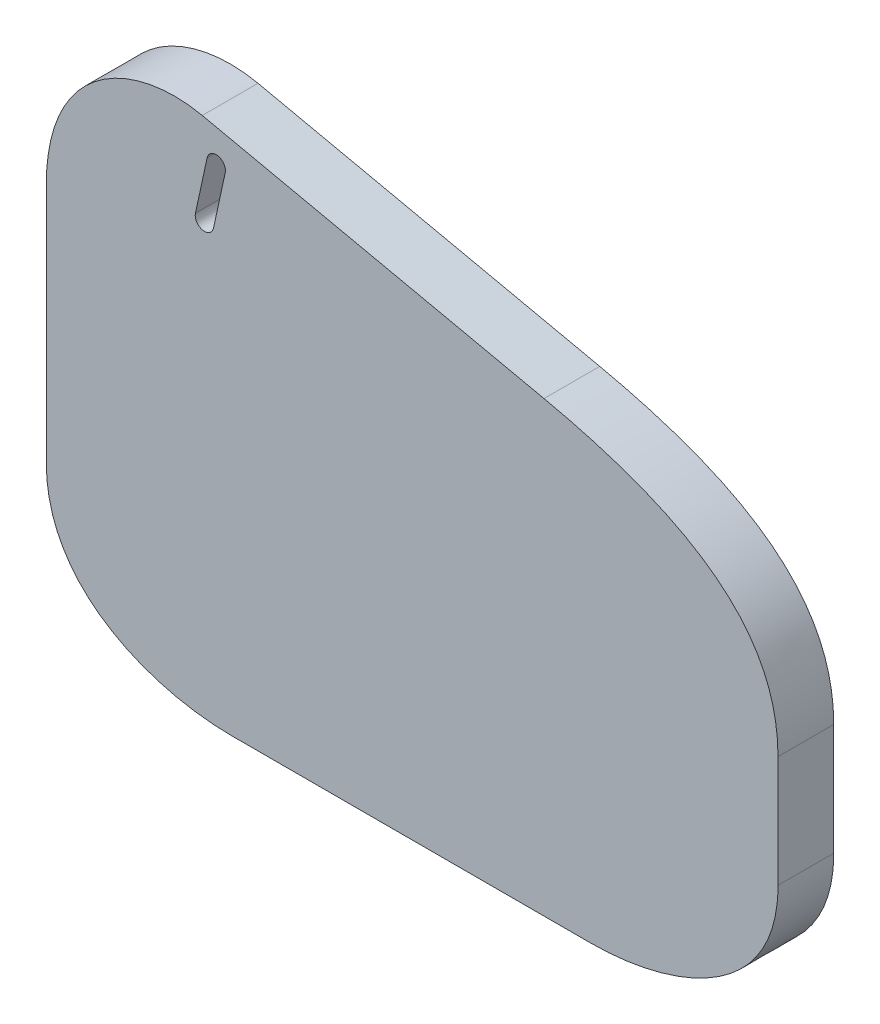
ISO-10303-21;
HEADER;
FILE_DESCRIPTION(('STEP AP214'),'2;1');
FILE_NAME('part.step','',(''),(''),'','','');
FILE_SCHEMA(('AUTOMOTIVE_DESIGN { 1 0 10303 214 1 1 1 1 }'));
ENDSEC;
DATA;
#1=APPLICATION_CONTEXT('core data for automotive mechanical design processes');
#2=APPLICATION_PROTOCOL_DEFINITION('international standard','automotive_design',2000,#1);
#3=PRODUCT_CONTEXT('',#1,'mechanical');
#4=PRODUCT('Part','Part','',(#3));
#5=PRODUCT_RELATED_PRODUCT_CATEGORY('part','',(#4));
#6=PRODUCT_DEFINITION_FORMATION('','',#4);
#7=PRODUCT_DEFINITION_CONTEXT('part definition',#1,'design');
#8=PRODUCT_DEFINITION('design','',#6,#7);
#9=PRODUCT_DEFINITION_SHAPE('','',#8);
#10=(LENGTH_UNIT() NAMED_UNIT(*) SI_UNIT(.MILLI.,.METRE.));
#11=(NAMED_UNIT(*) PLANE_ANGLE_UNIT() SI_UNIT($,.RADIAN.));
#12=(NAMED_UNIT(*) SI_UNIT($,.STERADIAN.) SOLID_ANGLE_UNIT());
#13=UNCERTAINTY_MEASURE_WITH_UNIT(LENGTH_MEASURE(1.E-05),#10,'distance_accuracy_value','');
#14=(GEOMETRIC_REPRESENTATION_CONTEXT(3) GLOBAL_UNCERTAINTY_ASSIGNED_CONTEXT((#13)) GLOBAL_UNIT_ASSIGNED_CONTEXT((#10,
#11,#12)) REPRESENTATION_CONTEXT('',''));
#15=CARTESIAN_POINT('',(0.,0.,0.));
#16=DIRECTION('',(0.,0.,1.));
#17=DIRECTION('',(1.,0.,0.));
#18=AXIS2_PLACEMENT_3D('',#15,#16,#17);
#19=CARTESIAN_POINT('',(-33.5451291028447,-25.7697680525164,10.));
#20=CARTESIAN_POINT('',(-19.4448665678301,-25.7697680525164,10.));
#21=CARTESIAN_POINT('',(0.,-19.0637574545764,10.));
#22=CARTESIAN_POINT('',(0.,0.,10.));
#23=B_SPLINE_CURVE_WITH_KNOTS('',3,(#19,#20,#21,#22),.UNSPECIFIED.,.F.,.F.,(4,4),(0.,1.),.UNSPECIFIED.);
#24=DIRECTION('',(0.,0.,-1.));
#25=VECTOR('',#24,1.);
#26=SURFACE_OF_LINEAR_EXTRUSION('',#23,#25);
#27=CARTESIAN_POINT('',(-33.5451291028447,-25.7697680525164,0.));
#28=CARTESIAN_POINT('',(-19.4448665678301,-25.7697680525164,0.));
#29=CARTESIAN_POINT('',(0.,-19.0637574545764,0.));
#30=CARTESIAN_POINT('',(0.,0.,0.));
#31=B_SPLINE_CURVE_WITH_KNOTS('',3,(#27,#28,#29,#30),.UNSPECIFIED.,.F.,.F.,(4,4),(0.,1.),.UNSPECIFIED.);
#32=CARTESIAN_POINT('',(-33.5451291028447,-25.7697680525164,0.));
#33=VERTEX_POINT('',#32);
#34=CARTESIAN_POINT('',(0.,0.,0.));
#35=VERTEX_POINT('',#34);
#36=EDGE_CURVE('E158',#33,#35,#31,.T.);
#37=ORIENTED_EDGE('',*,*,#36,.T.);
#38=DIRECTION('',(0.,0.,-1.));
#39=VECTOR('',#38,1.);
#40=CARTESIAN_POINT('',(0.,0.,10.));
#41=LINE('',#40,#39);
#42=CARTESIAN_POINT('',(0.,0.,10.));
#43=VERTEX_POINT('',#42);
#44=EDGE_CURVE('E11',#43,#35,#41,.T.);
#45=ORIENTED_EDGE('',*,*,#44,.F.);
#46=CARTESIAN_POINT('',(-33.5451291028447,-25.7697680525164,10.));
#47=VERTEX_POINT('',#46);
#48=EDGE_CURVE('E161',#47,#43,#23,.T.);
#49=ORIENTED_EDGE('',*,*,#48,.F.);
#50=DIRECTION('',(0.,0.,-1.));
#51=VECTOR('',#50,1.);
#52=CARTESIAN_POINT('',(-33.5451291028447,-25.7697680525164,10.));
#53=LINE('',#52,#51);
#54=EDGE_CURVE('E241',#47,#33,#53,.T.);
#55=ORIENTED_EDGE('',*,*,#54,.T.);
#56=EDGE_LOOP('',(#37,#45,#49,#55));
#57=FACE_BOUND('',#56,.T.);
#58=ADVANCED_FACE('F36',(#57),#26,.F.);
#59=CARTESIAN_POINT('',(0.,0.,10.));
#60=DIRECTION('',(-1.,0.,0.));
#61=DIRECTION('',(0.,0.,1.));
#62=AXIS2_PLACEMENT_3D('',#59,#60,#61);
#63=PLANE('',#62);
#64=DIRECTION('',(0.,1.,0.));
#65=VECTOR('',#64,1.);
#66=CARTESIAN_POINT('',(0.,0.,0.));
#67=LINE('',#66,#65);
#68=CARTESIAN_POINT('',(0.,20.,0.));
#69=VERTEX_POINT('',#68);
#70=EDGE_CURVE('E198',#35,#69,#67,.T.);
#71=ORIENTED_EDGE('',*,*,#70,.T.);
#72=DIRECTION('',(0.,0.,-1.));
#73=VECTOR('',#72,1.);
#74=CARTESIAN_POINT('',(0.,20.,10.));
#75=LINE('',#74,#73);
#76=CARTESIAN_POINT('',(0.,20.,10.));
#77=VERTEX_POINT('',#76);
#78=EDGE_CURVE('E44',#77,#69,#75,.T.);
#79=ORIENTED_EDGE('',*,*,#78,.F.);
#80=DIRECTION('',(0.,1.,0.));
#81=VECTOR('',#80,1.);
#82=CARTESIAN_POINT('',(0.,0.,10.));
#83=LINE('',#82,#81);
#84=EDGE_CURVE('E167',#43,#77,#83,.T.);
#85=ORIENTED_EDGE('',*,*,#84,.F.);
#86=ORIENTED_EDGE('',*,*,#44,.T.);
#87=EDGE_LOOP('',(#71,#79,#85,#86));
#88=FACE_BOUND('',#87,.T.);
#89=ADVANCED_FACE('F188',(#88),#63,.F.);
#90=CARTESIAN_POINT('',(0.,20.,10.));
#91=CARTESIAN_POINT('',(0.,38.1460258986672,10.));
#92=CARTESIAN_POINT('',(-14.2094741821754,48.6110988969908,10.));
#93=CARTESIAN_POINT('',(-41.9869496717725,54.6496805251641,10.));
#94=B_SPLINE_CURVE_WITH_KNOTS('',3,(#90,#91,#92,#93),.UNSPECIFIED.,.F.,.F.,(4,4),(0.,1.),.UNSPECIFIED.);
#95=DIRECTION('',(0.,0.,-1.));
#96=VECTOR('',#95,1.);
#97=SURFACE_OF_LINEAR_EXTRUSION('',#94,#96);
#98=CARTESIAN_POINT('',(0.,20.,0.));
#99=CARTESIAN_POINT('',(0.,38.1460258986672,0.));
#100=CARTESIAN_POINT('',(-14.2094741821754,48.6110988969908,0.));
#101=CARTESIAN_POINT('',(-41.9869496717725,54.6496805251641,0.));
#102=B_SPLINE_CURVE_WITH_KNOTS('',3,(#98,#99,#100,#101),.UNSPECIFIED.,.F.,.F.,(4,4),(0.,1.),.UNSPECIFIED.);
#103=CARTESIAN_POINT('',(-41.9869496717725,54.6496805251641,0.));
#104=VERTEX_POINT('',#103);
#105=EDGE_CURVE('E206',#69,#104,#102,.T.);
#106=ORIENTED_EDGE('',*,*,#105,.T.);
#107=DIRECTION('',(0.,0.,-1.));
#108=VECTOR('',#107,1.);
#109=CARTESIAN_POINT('',(-41.9869496717725,54.6496805251641,10.));
#110=LINE('',#109,#108);
#111=CARTESIAN_POINT('',(-41.9869496717725,54.6496805251641,10.));
#112=VERTEX_POINT('',#111);
#113=EDGE_CURVE('E210',#112,#104,#110,.T.);
#114=ORIENTED_EDGE('',*,*,#113,.F.);
#115=EDGE_CURVE('E173',#77,#112,#94,.T.);
#116=ORIENTED_EDGE('',*,*,#115,.F.);
#117=ORIENTED_EDGE('',*,*,#78,.T.);
#118=EDGE_LOOP('',(#106,#114,#116,#117));
#119=FACE_BOUND('',#118,.T.);
#120=ADVANCED_FACE('F184',(#119),#97,.F.);
#121=CARTESIAN_POINT('',(-41.9869496717725,54.6496805251641,10.));
#122=DIRECTION('',(-0.212429644331044,-0.977176363922801,0.));
#123=DIRECTION('',(0.977176363922801,-0.212429644331044,0.));
#124=AXIS2_PLACEMENT_3D('',#121,#122,#123);
#125=PLANE('',#124);
#126=DIRECTION('',(-0.977176363922801,0.212429644331044,0.));
#127=VECTOR('',#126,1.);
#128=CARTESIAN_POINT('',(-41.9869496717725,54.6496805251641,0.));
#129=LINE('',#128,#127);
#130=CARTESIAN_POINT('',(-103.301225382932,67.9788708971554,0.));
#131=VERTEX_POINT('',#130);
#132=EDGE_CURVE('E214',#104,#131,#129,.T.);
#133=ORIENTED_EDGE('',*,*,#132,.T.);
#134=DIRECTION('',(0.,0.,-1.));
#135=VECTOR('',#134,1.);
#136=CARTESIAN_POINT('',(-103.301225382932,67.9788708971554,10.));
#137=LINE('',#136,#135);
#138=CARTESIAN_POINT('',(-103.301225382932,67.9788708971554,10.));
#139=VERTEX_POINT('',#138);
#140=EDGE_CURVE('E254',#139,#131,#137,.T.);
#141=ORIENTED_EDGE('',*,*,#140,.F.);
#142=DIRECTION('',(-0.977176363922801,0.212429644331044,0.));
#143=VECTOR('',#142,1.);
#144=CARTESIAN_POINT('',(-41.9869496717725,54.6496805251641,10.));
#145=LINE('',#144,#143);
#146=EDGE_CURVE('E178',#112,#139,#145,.T.);
#147=ORIENTED_EDGE('',*,*,#146,.F.);
#148=ORIENTED_EDGE('',*,*,#113,.T.);
#149=EDGE_LOOP('',(#133,#141,#147,#148));
#150=FACE_BOUND('',#149,.T.);
#151=ADVANCED_FACE('F187',(#150),#125,.F.);
#152=CARTESIAN_POINT('',(-103.301225382932,67.9788708971554,10.));
#153=CARTESIAN_POINT('',(-115.500001367253,70.6307787198339,10.));
#154=CARTESIAN_POINT('',(-131.292525164114,63.3933061839038,10.));
#155=CARTESIAN_POINT('',(-131.292525164114,43.097715536105,10.));
#156=B_SPLINE_CURVE_WITH_KNOTS('',3,(#152,#153,#154,#155),.UNSPECIFIED.,.F.,.F.,(4,4),(0.,1.),.UNSPECIFIED.);
#157=DIRECTION('',(0.,0.,-1.));
#158=VECTOR('',#157,1.);
#159=SURFACE_OF_LINEAR_EXTRUSION('',#156,#158);
#160=CARTESIAN_POINT('',(-103.301225382932,67.9788708971554,0.));
#161=CARTESIAN_POINT('',(-115.500001367253,70.6307787198339,0.));
#162=CARTESIAN_POINT('',(-131.292525164114,63.3933061839038,0.));
#163=CARTESIAN_POINT('',(-131.292525164114,43.097715536105,0.));
#164=B_SPLINE_CURVE_WITH_KNOTS('',3,(#160,#161,#162,#163),.UNSPECIFIED.,.F.,.F.,(4,4),(0.,1.),.UNSPECIFIED.);
#165=CARTESIAN_POINT('',(-131.292525164114,43.097715536105,0.));
#166=VERTEX_POINT('',#165);
#167=EDGE_CURVE('E216',#131,#166,#164,.T.);
#168=ORIENTED_EDGE('',*,*,#167,.T.);
#169=DIRECTION('',(0.,0.,-1.));
#170=VECTOR('',#169,1.);
#171=CARTESIAN_POINT('',(-131.292525164114,43.097715536105,10.));
#172=LINE('',#171,#170);
#173=CARTESIAN_POINT('',(-131.292525164114,43.097715536105,10.));
#174=VERTEX_POINT('',#173);
#175=EDGE_CURVE('E251',#174,#166,#172,.T.);
#176=ORIENTED_EDGE('',*,*,#175,.F.);
#177=EDGE_CURVE('E261',#139,#174,#156,.T.);
#178=ORIENTED_EDGE('',*,*,#177,.F.);
#179=ORIENTED_EDGE('',*,*,#140,.T.);
#180=EDGE_LOOP('',(#168,#176,#178,#179));
#181=FACE_BOUND('',#180,.T.);
#182=ADVANCED_FACE('F273',(#181),#159,.F.);
#183=CARTESIAN_POINT('',(-131.292525164114,43.097715536105,10.));
#184=DIRECTION('',(1.,0.,0.));
#185=DIRECTION('',(0.,0.,-1.));
#186=AXIS2_PLACEMENT_3D('',#183,#184,#185);
#187=PLANE('',#186);
#188=DIRECTION('',(0.,-1.,0.));
#189=VECTOR('',#188,1.);
#190=CARTESIAN_POINT('',(-131.292525164114,43.097715536105,0.));
#191=LINE('',#190,#189);
#192=CARTESIAN_POINT('',(-131.292525164114,0.,0.));
#193=VERTEX_POINT('',#192);
#194=EDGE_CURVE('E228',#166,#193,#191,.T.);
#195=ORIENTED_EDGE('',*,*,#194,.T.);
#196=DIRECTION('',(0.,0.,-1.));
#197=VECTOR('',#196,1.);
#198=CARTESIAN_POINT('',(-131.292525164114,0.,10.));
#199=LINE('',#198,#197);
#200=CARTESIAN_POINT('',(-131.292525164114,0.,10.));
#201=VERTEX_POINT('',#200);
#202=EDGE_CURVE('E248',#201,#193,#199,.T.);
#203=ORIENTED_EDGE('',*,*,#202,.F.);
#204=DIRECTION('',(0.,-1.,0.));
#205=VECTOR('',#204,1.);
#206=CARTESIAN_POINT('',(-131.292525164114,43.097715536105,10.));
#207=LINE('',#206,#205);
#208=EDGE_CURVE('E262',#174,#201,#207,.T.);
#209=ORIENTED_EDGE('',*,*,#208,.F.);
#210=ORIENTED_EDGE('',*,*,#175,.T.);
#211=EDGE_LOOP('',(#195,#203,#209,#210));
#212=FACE_BOUND('',#211,.T.);
#213=ADVANCED_FACE('F276',(#212),#187,.F.);
#214=CARTESIAN_POINT('',(-131.292525164114,0.,10.));
#215=CARTESIAN_POINT('',(-131.292525164114,-19.0251558180361,10.));
#216=CARTESIAN_POINT('',(-112.011160689261,-25.7697680525164,10.));
#217=CARTESIAN_POINT('',(-97.9695492341357,-25.7697680525164,10.));
#218=B_SPLINE_CURVE_WITH_KNOTS('',3,(#214,#215,#216,#217),.UNSPECIFIED.,.F.,.F.,(4,4),(0.,1.),.UNSPECIFIED.);
#219=DIRECTION('',(0.,0.,-1.));
#220=VECTOR('',#219,1.);
#221=SURFACE_OF_LINEAR_EXTRUSION('',#218,#220);
#222=CARTESIAN_POINT('',(-131.292525164114,0.,0.));
#223=CARTESIAN_POINT('',(-131.292525164114,-19.0251558180361,0.));
#224=CARTESIAN_POINT('',(-112.011160689261,-25.7697680525164,0.));
#225=CARTESIAN_POINT('',(-97.9695492341357,-25.7697680525164,0.));
#226=B_SPLINE_CURVE_WITH_KNOTS('',3,(#222,#223,#224,#225),.UNSPECIFIED.,.F.,.F.,(4,4),(0.,1.),.UNSPECIFIED.);
#227=CARTESIAN_POINT('',(-97.9695492341357,-25.7697680525164,0.));
#228=VERTEX_POINT('',#227);
#229=EDGE_CURVE('E233',#193,#228,#226,.T.);
#230=ORIENTED_EDGE('',*,*,#229,.T.);
#231=DIRECTION('',(0.,0.,-1.));
#232=VECTOR('',#231,1.);
#233=CARTESIAN_POINT('',(-97.9695492341357,-25.7697680525164,10.));
#234=LINE('',#233,#232);
#235=CARTESIAN_POINT('',(-97.9695492341357,-25.7697680525164,10.));
#236=VERTEX_POINT('',#235);
#237=EDGE_CURVE('E244',#236,#228,#234,.T.);
#238=ORIENTED_EDGE('',*,*,#237,.F.);
#239=EDGE_CURVE('E264',#201,#236,#218,.T.);
#240=ORIENTED_EDGE('',*,*,#239,.F.);
#241=ORIENTED_EDGE('',*,*,#202,.T.);
#242=EDGE_LOOP('',(#230,#238,#240,#241));
#243=FACE_BOUND('',#242,.T.);
#244=ADVANCED_FACE('F280',(#243),#221,.F.);
#245=CARTESIAN_POINT('',(-33.5451291028447,-25.7697680525164,10.));
#246=DIRECTION('',(0.,1.,0.));
#247=DIRECTION('',(0.,0.,1.));
#248=AXIS2_PLACEMENT_3D('',#245,#246,#247);
#249=PLANE('',#248);
#250=DIRECTION('',(1.,0.,0.));
#251=VECTOR('',#250,1.);
#252=CARTESIAN_POINT('',(-33.5451291028447,-25.7697680525164,0.));
#253=LINE('',#252,#251);
#254=EDGE_CURVE('E168',#228,#33,#253,.T.);
#255=ORIENTED_EDGE('',*,*,#254,.T.);
#256=ORIENTED_EDGE('',*,*,#54,.F.);
#257=DIRECTION('',(1.,0.,0.));
#258=VECTOR('',#257,1.);
#259=CARTESIAN_POINT('',(-33.5451291028447,-25.7697680525164,10.));
#260=LINE('',#259,#258);
#261=EDGE_CURVE('E245',#236,#47,#260,.T.);
#262=ORIENTED_EDGE('',*,*,#261,.F.);
#263=ORIENTED_EDGE('',*,*,#237,.T.);
#264=EDGE_LOOP('',(#255,#256,#262,#263));
#265=FACE_BOUND('',#264,.T.);
#266=ADVANCED_FACE('F284',(#265),#249,.F.);
#267=CARTESIAN_POINT('',(-11.4849661007919,-20.0337930717244,10.));
#268=DIRECTION('',(0.,0.,-1.));
#269=DIRECTION('',(-1.,0.,0.));
#270=AXIS2_PLACEMENT_3D('',#267,#268,#269);
#271=PLANE('',#270);
#272=DIRECTION('',(-0.212429644331042,-0.977176363922801,0.));
#273=VECTOR('',#272,1.);
#274=CARTESIAN_POINT('',(-102.429251955031,61.8328823716601,10.));
#275=LINE('',#274,#273);
#276=CARTESIAN_POINT('',(-102.429251955031,61.8328823716601,10.));
#277=VERTEX_POINT('',#276);
#278=CARTESIAN_POINT('',(-104.52778969342,52.1796087750684,10.));
#279=VERTEX_POINT('',#278);
#280=EDGE_CURVE('E134',#277,#279,#275,.T.);
#281=ORIENTED_EDGE('',*,*,#280,.F.);
#282=CARTESIAN_POINT('',(-100.808408277594,61.4805250504783,10.));
#283=DIRECTION('',(0.,0.,-1.));
#284=DIRECTION('',(-1.,0.,0.));
#285=AXIS2_PLACEMENT_3D('',#282,#283,#284);
#286=CIRCLE('',#285,1.65870127162068);
#287=CARTESIAN_POINT('',(-99.1875646001578,61.1281677292964,10.));
#288=VERTEX_POINT('',#287);
#289=EDGE_CURVE('E128',#277,#288,#286,.T.);
#290=ORIENTED_EDGE('',*,*,#289,.T.);
#291=DIRECTION('',(-0.212429644331042,-0.977176363922801,0.));
#292=VECTOR('',#291,1.);
#293=CARTESIAN_POINT('',(-99.1875646001578,61.1281677292964,10.));
#294=LINE('',#293,#292);
#295=CARTESIAN_POINT('',(-101.286102338547,51.4748941327048,10.));
#296=VERTEX_POINT('',#295);
#297=EDGE_CURVE('E137',#288,#296,#294,.T.);
#298=ORIENTED_EDGE('',*,*,#297,.T.);
#299=CARTESIAN_POINT('',(-102.906946015984,51.8272514538866,10.));
#300=DIRECTION('',(0.,0.,-1.));
#301=DIRECTION('',(-1.,0.,0.));
#302=AXIS2_PLACEMENT_3D('',#299,#300,#301);
#303=CIRCLE('',#302,1.65870127162068);
#304=EDGE_CURVE('E51',#296,#279,#303,.T.);
#305=ORIENTED_EDGE('',*,*,#304,.T.);
#306=EDGE_LOOP('',(#281,#290,#298,#305));
#307=FACE_BOUND('',#306,.T.);
#308=ORIENTED_EDGE('',*,*,#48,.T.);
#309=ORIENTED_EDGE('',*,*,#84,.T.);
#310=ORIENTED_EDGE('',*,*,#115,.T.);
#311=ORIENTED_EDGE('',*,*,#146,.T.);
#312=ORIENTED_EDGE('',*,*,#177,.T.);
#313=ORIENTED_EDGE('',*,*,#208,.T.);
#314=ORIENTED_EDGE('',*,*,#239,.T.);
#315=ORIENTED_EDGE('',*,*,#261,.T.);
#316=EDGE_LOOP('',(#308,#309,#310,#311,#312,#313,#314,#315));
#317=FACE_BOUND('',#316,.T.);
#318=ADVANCED_FACE('F141',(#307,#317),#271,.F.);
#319=CARTESIAN_POINT('',(-11.4849661007919,-20.0337930717244,0.));
#320=DIRECTION('',(0.,0.,-1.));
#321=DIRECTION('',(-1.,0.,0.));
#322=AXIS2_PLACEMENT_3D('',#319,#320,#321);
#323=PLANE('',#322);
#324=CARTESIAN_POINT('',(-100.808408277594,61.4805250504783,0.));
#325=DIRECTION('',(0.,0.,-1.));
#326=DIRECTION('',(-1.,0.,0.));
#327=AXIS2_PLACEMENT_3D('',#324,#325,#326);
#328=CIRCLE('',#327,1.65870127162068);
#329=CARTESIAN_POINT('',(-102.429251955031,61.8328823716601,0.));
#330=VERTEX_POINT('',#329);
#331=CARTESIAN_POINT('',(-99.1875646001578,61.1281677292964,0.));
#332=VERTEX_POINT('',#331);
#333=EDGE_CURVE('E59',#330,#332,#328,.T.);
#334=ORIENTED_EDGE('',*,*,#333,.F.);
#335=DIRECTION('',(-0.212429644331042,-0.977176363922801,0.));
#336=VECTOR('',#335,1.);
#337=CARTESIAN_POINT('',(-102.429251955031,61.8328823716601,0.));
#338=LINE('',#337,#336);
#339=CARTESIAN_POINT('',(-104.52778969342,52.1796087750684,0.));
#340=VERTEX_POINT('',#339);
#341=EDGE_CURVE('E143',#330,#340,#338,.T.);
#342=ORIENTED_EDGE('',*,*,#341,.T.);
#343=CARTESIAN_POINT('',(-102.906946015984,51.8272514538866,0.));
#344=DIRECTION('',(0.,0.,-1.));
#345=DIRECTION('',(-1.,0.,0.));
#346=AXIS2_PLACEMENT_3D('',#343,#344,#345);
#347=CIRCLE('',#346,1.65870127162068);
#348=CARTESIAN_POINT('',(-101.286102338547,51.4748941327048,0.));
#349=VERTEX_POINT('',#348);
#350=EDGE_CURVE('E146',#349,#340,#347,.T.);
#351=ORIENTED_EDGE('',*,*,#350,.F.);
#352=DIRECTION('',(-0.212429644331042,-0.977176363922801,0.));
#353=VECTOR('',#352,1.);
#354=CARTESIAN_POINT('',(-99.1875646001578,61.1281677292964,0.));
#355=LINE('',#354,#353);
#356=EDGE_CURVE('E152',#332,#349,#355,.T.);
#357=ORIENTED_EDGE('',*,*,#356,.F.);
#358=EDGE_LOOP('',(#334,#342,#351,#357));
#359=FACE_BOUND('',#358,.T.);
#360=ORIENTED_EDGE('',*,*,#36,.F.);
#361=ORIENTED_EDGE('',*,*,#254,.F.);
#362=ORIENTED_EDGE('',*,*,#229,.F.);
#363=ORIENTED_EDGE('',*,*,#194,.F.);
#364=ORIENTED_EDGE('',*,*,#167,.F.);
#365=ORIENTED_EDGE('',*,*,#132,.F.);
#366=ORIENTED_EDGE('',*,*,#105,.F.);
#367=ORIENTED_EDGE('',*,*,#70,.F.);
#368=EDGE_LOOP('',(#360,#361,#362,#363,#364,#365,#366,#367));
#369=FACE_BOUND('',#368,.T.);
#370=ADVANCED_FACE('F212',(#359,#369),#323,.T.);
#371=CARTESIAN_POINT('',(-100.808408277594,61.4805250504783,10.));
#372=DIRECTION('',(0.,0.,-1.));
#373=DIRECTION('',(-1.,0.,0.));
#374=AXIS2_PLACEMENT_3D('',#371,#372,#373);
#375=CYLINDRICAL_SURFACE('',#374,1.65870127162068);
#376=ORIENTED_EDGE('',*,*,#333,.T.);
#377=DIRECTION('',(0.,0.,-1.));
#378=VECTOR('',#377,1.);
#379=CARTESIAN_POINT('',(-99.1875646001578,61.1281677292964,10.));
#380=LINE('',#379,#378);
#381=EDGE_CURVE('E124',#288,#332,#380,.T.);
#382=ORIENTED_EDGE('',*,*,#381,.F.);
#383=ORIENTED_EDGE('',*,*,#289,.F.);
#384=DIRECTION('',(0.,0.,-1.));
#385=VECTOR('',#384,1.);
#386=CARTESIAN_POINT('',(-102.429251955031,61.8328823716601,10.));
#387=LINE('',#386,#385);
#388=EDGE_CURVE('E156',#277,#330,#387,.T.);
#389=ORIENTED_EDGE('',*,*,#388,.T.);
#390=EDGE_LOOP('',(#376,#382,#383,#389));
#391=FACE_BOUND('',#390,.T.);
#392=ADVANCED_FACE('F126',(#391),#375,.F.);
#393=CARTESIAN_POINT('',(-102.429251955031,61.8328823716601,10.));
#394=DIRECTION('',(0.977176363922801,-0.212429644331042,0.));
#395=DIRECTION('',(0.212429644331042,0.977176363922801,0.));
#396=AXIS2_PLACEMENT_3D('',#393,#394,#395);
#397=PLANE('',#396);
#398=ORIENTED_EDGE('',*,*,#341,.F.);
#399=ORIENTED_EDGE('',*,*,#388,.F.);
#400=ORIENTED_EDGE('',*,*,#280,.T.);
#401=DIRECTION('',(0.,0.,-1.));
#402=VECTOR('',#401,1.);
#403=CARTESIAN_POINT('',(-104.52778969342,52.1796087750684,10.));
#404=LINE('',#403,#402);
#405=EDGE_CURVE('E159',#279,#340,#404,.T.);
#406=ORIENTED_EDGE('',*,*,#405,.T.);
#407=EDGE_LOOP('',(#398,#399,#400,#406));
#408=FACE_BOUND('',#407,.T.);
#409=ADVANCED_FACE('F320',(#408),#397,.T.);
#410=CARTESIAN_POINT('',(-102.906946015984,51.8272514538866,10.));
#411=DIRECTION('',(0.,0.,-1.));
#412=DIRECTION('',(-1.,0.,0.));
#413=AXIS2_PLACEMENT_3D('',#410,#411,#412);
#414=CYLINDRICAL_SURFACE('',#413,1.65870127162068);
#415=ORIENTED_EDGE('',*,*,#350,.T.);
#416=ORIENTED_EDGE('',*,*,#405,.F.);
#417=ORIENTED_EDGE('',*,*,#304,.F.);
#418=DIRECTION('',(0.,0.,-1.));
#419=VECTOR('',#418,1.);
#420=CARTESIAN_POINT('',(-101.286102338547,51.4748941327048,10.));
#421=LINE('',#420,#419);
#422=EDGE_CURVE('E133',#296,#349,#421,.T.);
#423=ORIENTED_EDGE('',*,*,#422,.T.);
#424=EDGE_LOOP('',(#415,#416,#417,#423));
#425=FACE_BOUND('',#424,.T.);
#426=ADVANCED_FACE('F323',(#425),#414,.F.);
#427=CARTESIAN_POINT('',(-99.1875646001578,61.1281677292964,10.));
#428=DIRECTION('',(0.977176363922801,-0.212429644331042,0.));
#429=DIRECTION('',(0.212429644331042,0.977176363922801,0.));
#430=AXIS2_PLACEMENT_3D('',#427,#428,#429);
#431=PLANE('',#430);
#432=ORIENTED_EDGE('',*,*,#356,.T.);
#433=ORIENTED_EDGE('',*,*,#422,.F.);
#434=ORIENTED_EDGE('',*,*,#297,.F.);
#435=ORIENTED_EDGE('',*,*,#381,.T.);
#436=EDGE_LOOP('',(#432,#433,#434,#435));
#437=FACE_BOUND('',#436,.T.);
#438=ADVANCED_FACE('F138',(#437),#431,.F.);
#439=CLOSED_SHELL('',(#58,#89,#120,#151,#182,#213,#244,#266,#318,#370,#392,#409,#426,#438));
#440=MANIFOLD_SOLID_BREP('B2',#439);
#441=ADVANCED_BREP_SHAPE_REPRESENTATION('',(#18,#440),#14);
#442=SHAPE_DEFINITION_REPRESENTATION(#9,#441);
ENDSEC;
END-ISO-10303-21;
